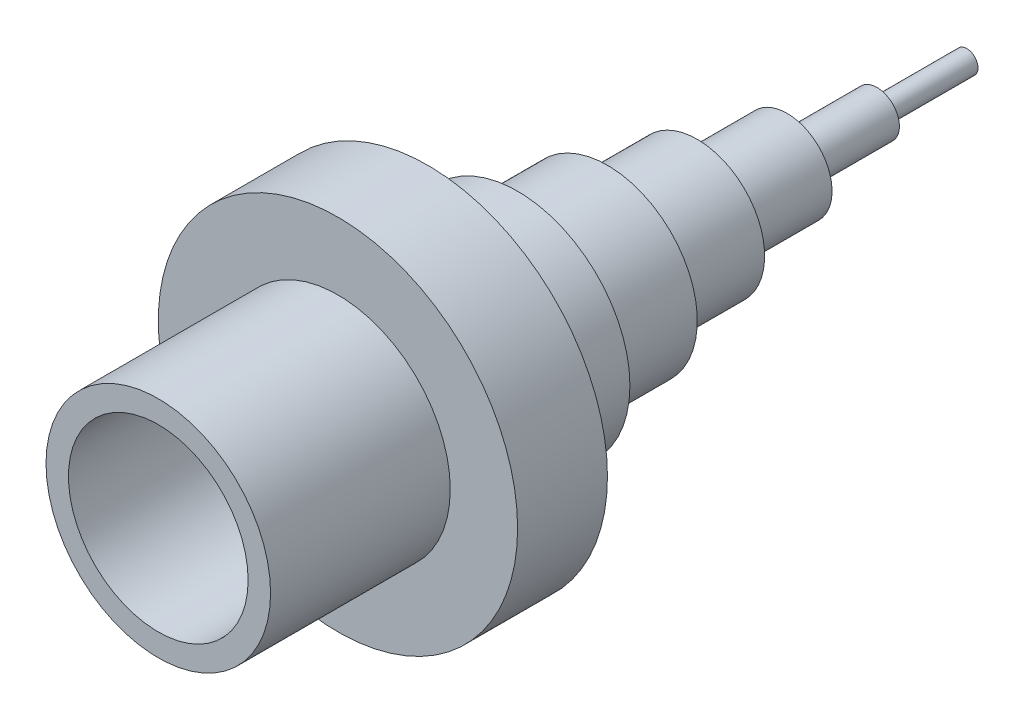
ISO-10303-21;
HEADER;
FILE_DESCRIPTION(('STEP AP214'),'2;1');
FILE_NAME('part.step','',(''),(''),'','','');
FILE_SCHEMA(('AUTOMOTIVE_DESIGN { 1 0 10303 214 1 1 1 1 }'));
ENDSEC;
DATA;
#1=APPLICATION_CONTEXT('core data for automotive mechanical design processes');
#2=APPLICATION_PROTOCOL_DEFINITION('international standard','automotive_design',2000,#1);
#3=PRODUCT_CONTEXT('',#1,'mechanical');
#4=PRODUCT('Part','Part','',(#3));
#5=PRODUCT_RELATED_PRODUCT_CATEGORY('part','',(#4));
#6=PRODUCT_DEFINITION_FORMATION('','',#4);
#7=PRODUCT_DEFINITION_CONTEXT('part definition',#1,'design');
#8=PRODUCT_DEFINITION('design','',#6,#7);
#9=PRODUCT_DEFINITION_SHAPE('','',#8);
#10=(LENGTH_UNIT() NAMED_UNIT(*) SI_UNIT(.MILLI.,.METRE.));
#11=(NAMED_UNIT(*) PLANE_ANGLE_UNIT() SI_UNIT($,.RADIAN.));
#12=(NAMED_UNIT(*) SI_UNIT($,.STERADIAN.) SOLID_ANGLE_UNIT());
#13=UNCERTAINTY_MEASURE_WITH_UNIT(LENGTH_MEASURE(1.E-05),#10,'distance_accuracy_value','');
#14=(GEOMETRIC_REPRESENTATION_CONTEXT(3) GLOBAL_UNCERTAINTY_ASSIGNED_CONTEXT((#13)) GLOBAL_UNIT_ASSIGNED_CONTEXT((#10,
#11,#12)) REPRESENTATION_CONTEXT('',''));
#15=CARTESIAN_POINT('',(0.,0.,0.));
#16=DIRECTION('',(0.,0.,1.));
#17=DIRECTION('',(1.,0.,0.));
#18=AXIS2_PLACEMENT_3D('',#15,#16,#17);
#19=CARTESIAN_POINT('',(0.,0.,508.));
#20=DIRECTION('',(0.,0.,-1.));
#21=DIRECTION('',(-1.,0.,0.));
#22=AXIS2_PLACEMENT_3D('',#19,#20,#21);
#23=CYLINDRICAL_SURFACE('',#22,1016.);
#24=CARTESIAN_POINT('',(0.,0.,508.));
#25=DIRECTION('',(0.,0.,1.));
#26=DIRECTION('',(1.,0.,0.));
#27=AXIS2_PLACEMENT_3D('',#24,#25,#26);
#28=CIRCLE('',#27,1016.);
#29=CARTESIAN_POINT('',(1016.,0.,508.));
#30=VERTEX_POINT('',#29);
#31=EDGE_CURVE('E84',#30,#30,#28,.T.);
#32=ORIENTED_EDGE('',*,*,#31,.F.);
#33=EDGE_LOOP('',(#32));
#34=FACE_BOUND('',#33,.T.);
#35=CARTESIAN_POINT('',(0.,0.,0.));
#36=DIRECTION('',(0.,0.,1.));
#37=DIRECTION('',(1.,0.,0.));
#38=AXIS2_PLACEMENT_3D('',#35,#36,#37);
#39=CIRCLE('',#38,1016.);
#40=CARTESIAN_POINT('',(1016.,0.,0.));
#41=VERTEX_POINT('',#40);
#42=EDGE_CURVE('E81',#41,#41,#39,.T.);
#43=ORIENTED_EDGE('',*,*,#42,.T.);
#44=EDGE_LOOP('',(#43));
#45=FACE_BOUND('',#44,.T.);
#46=ADVANCED_FACE('F31',(#34,#45),#23,.T.);
#47=CARTESIAN_POINT('',(0.,0.,508.));
#48=DIRECTION('',(0.,0.,1.));
#49=DIRECTION('',(1.,0.,0.));
#50=AXIS2_PLACEMENT_3D('',#47,#48,#49);
#51=PLANE('',#50);
#52=CARTESIAN_POINT('',(0.,0.,508.));
#53=DIRECTION('',(0.,0.,1.));
#54=DIRECTION('',(1.,0.,0.));
#55=AXIS2_PLACEMENT_3D('',#52,#53,#54);
#56=CIRCLE('',#55,635.);
#57=CARTESIAN_POINT('',(635.,0.,508.));
#58=VERTEX_POINT('',#57);
#59=EDGE_CURVE('E77',#58,#58,#56,.T.);
#60=ORIENTED_EDGE('',*,*,#59,.F.);
#61=EDGE_LOOP('',(#60));
#62=FACE_BOUND('',#61,.T.);
#63=ORIENTED_EDGE('',*,*,#31,.T.);
#64=EDGE_LOOP('',(#63));
#65=FACE_BOUND('',#64,.T.);
#66=ADVANCED_FACE('F93',(#62,#65),#51,.T.);
#67=CARTESIAN_POINT('',(0.,0.,0.));
#68=DIRECTION('',(0.,0.,1.));
#69=DIRECTION('',(1.,0.,0.));
#70=AXIS2_PLACEMENT_3D('',#67,#68,#69);
#71=PLANE('',#70);
#72=CARTESIAN_POINT('',(0.,0.,0.));
#73=DIRECTION('',(0.,0.,-1.));
#74=DIRECTION('',(-1.,0.,0.));
#75=AXIS2_PLACEMENT_3D('',#72,#73,#74);
#76=CIRCLE('',#75,635.);
#77=CARTESIAN_POINT('',(-635.,0.,0.));
#78=VERTEX_POINT('',#77);
#79=EDGE_CURVE('E69',#78,#78,#76,.T.);
#80=ORIENTED_EDGE('',*,*,#79,.F.);
#81=EDGE_LOOP('',(#80));
#82=FACE_BOUND('',#81,.T.);
#83=ORIENTED_EDGE('',*,*,#42,.F.);
#84=EDGE_LOOP('',(#83));
#85=FACE_BOUND('',#84,.T.);
#86=ADVANCED_FACE('F90',(#82,#85),#71,.F.);
#87=CARTESIAN_POINT('',(0.,0.,1524.));
#88=DIRECTION('',(0.,0.,1.));
#89=DIRECTION('',(1.,0.,0.));
#90=AXIS2_PLACEMENT_3D('',#87,#88,#89);
#91=PLANE('',#90);
#92=CARTESIAN_POINT('',(0.,0.,1524.));
#93=DIRECTION('',(0.,0.,1.));
#94=DIRECTION('',(1.,0.,0.));
#95=AXIS2_PLACEMENT_3D('',#92,#93,#94);
#96=CIRCLE('',#95,635.);
#97=CARTESIAN_POINT('',(635.,0.,1524.));
#98=VERTEX_POINT('',#97);
#99=EDGE_CURVE('E78',#98,#98,#96,.T.);
#100=ORIENTED_EDGE('',*,*,#99,.T.);
#101=EDGE_LOOP('',(#100));
#102=FACE_BOUND('',#101,.T.);
#103=CARTESIAN_POINT('',(0.,0.,1524.));
#104=DIRECTION('',(0.,0.,1.));
#105=DIRECTION('',(1.,0.,0.));
#106=AXIS2_PLACEMENT_3D('',#103,#104,#105);
#107=CIRCLE('',#106,508.);
#108=CARTESIAN_POINT('',(508.,0.,1524.));
#109=VERTEX_POINT('',#108);
#110=EDGE_CURVE('E72',#109,#109,#107,.T.);
#111=ORIENTED_EDGE('',*,*,#110,.F.);
#112=EDGE_LOOP('',(#111));
#113=FACE_BOUND('',#112,.T.);
#114=ADVANCED_FACE('F92',(#102,#113),#91,.T.);
#115=CARTESIAN_POINT('',(0.,0.,1524.));
#116=DIRECTION('',(0.,0.,-1.));
#117=DIRECTION('',(-1.,0.,0.));
#118=AXIS2_PLACEMENT_3D('',#115,#116,#117);
#119=CYLINDRICAL_SURFACE('',#118,635.);
#120=ORIENTED_EDGE('',*,*,#99,.F.);
#121=EDGE_LOOP('',(#120));
#122=FACE_BOUND('',#121,.T.);
#123=ORIENTED_EDGE('',*,*,#59,.T.);
#124=EDGE_LOOP('',(#123));
#125=FACE_BOUND('',#124,.T.);
#126=ADVANCED_FACE('F99',(#122,#125),#119,.T.);
#127=CARTESIAN_POINT('',(0.,0.,1524.));
#128=DIRECTION('',(0.,0.,-1.));
#129=DIRECTION('',(-1.,0.,0.));
#130=AXIS2_PLACEMENT_3D('',#127,#128,#129);
#131=CYLINDRICAL_SURFACE('',#130,508.);
#132=ORIENTED_EDGE('',*,*,#110,.T.);
#133=EDGE_LOOP('',(#132));
#134=FACE_BOUND('',#133,.T.);
#135=CARTESIAN_POINT('',(0.,0.,508.));
#136=DIRECTION('',(0.,0.,1.));
#137=DIRECTION('',(1.,0.,0.));
#138=AXIS2_PLACEMENT_3D('',#135,#136,#137);
#139=CIRCLE('',#138,508.);
#140=CARTESIAN_POINT('',(508.,0.,508.));
#141=VERTEX_POINT('',#140);
#142=EDGE_CURVE('E34',#141,#141,#139,.F.);
#143=ORIENTED_EDGE('',*,*,#142,.T.);
#144=EDGE_LOOP('',(#143));
#145=FACE_BOUND('',#144,.T.);
#146=ADVANCED_FACE('F133',(#134,#145),#131,.F.);
#147=ORIENTED_EDGE('',*,*,#142,.F.);
#148=EDGE_LOOP('',(#147));
#149=FACE_BOUND('',#148,.T.);
#150=ADVANCED_FACE('F104',(#149),#51,.T.);
#151=CARTESIAN_POINT('',(0.,0.,-508.));
#152=DIRECTION('',(0.,0.,1.));
#153=DIRECTION('',(1.,0.,0.));
#154=AXIS2_PLACEMENT_3D('',#151,#152,#153);
#155=CYLINDRICAL_SURFACE('',#154,635.);
#156=CARTESIAN_POINT('',(0.,0.,-508.));
#157=DIRECTION('',(0.,0.,-1.));
#158=DIRECTION('',(-1.,0.,0.));
#159=AXIS2_PLACEMENT_3D('',#156,#157,#158);
#160=CIRCLE('',#159,635.);
#161=CARTESIAN_POINT('',(-635.,0.,-508.));
#162=VERTEX_POINT('',#161);
#163=EDGE_CURVE('E66',#162,#162,#160,.T.);
#164=ORIENTED_EDGE('',*,*,#163,.F.);
#165=EDGE_LOOP('',(#164));
#166=FACE_BOUND('',#165,.T.);
#167=ORIENTED_EDGE('',*,*,#79,.T.);
#168=EDGE_LOOP('',(#167));
#169=FACE_BOUND('',#168,.T.);
#170=ADVANCED_FACE('F151',(#166,#169),#155,.T.);
#171=CARTESIAN_POINT('',(0.,0.,-508.));
#172=DIRECTION('',(0.,0.,-1.));
#173=DIRECTION('',(-1.,0.,0.));
#174=AXIS2_PLACEMENT_3D('',#171,#172,#173);
#175=PLANE('',#174);
#176=CARTESIAN_POINT('',(0.,0.,-508.));
#177=DIRECTION('',(0.,0.,-1.));
#178=DIRECTION('',(-1.,0.,0.));
#179=AXIS2_PLACEMENT_3D('',#176,#177,#178);
#180=CIRCLE('',#179,508.);
#181=CARTESIAN_POINT('',(-508.,0.,-508.));
#182=VERTEX_POINT('',#181);
#183=EDGE_CURVE('E63',#182,#182,#180,.T.);
#184=ORIENTED_EDGE('',*,*,#183,.F.);
#185=EDGE_LOOP('',(#184));
#186=FACE_BOUND('',#185,.T.);
#187=ORIENTED_EDGE('',*,*,#163,.T.);
#188=EDGE_LOOP('',(#187));
#189=FACE_BOUND('',#188,.T.);
#190=ADVANCED_FACE('F163',(#186,#189),#175,.T.);
#191=CARTESIAN_POINT('',(0.,0.,-1016.));
#192=DIRECTION('',(0.,0.,1.));
#193=DIRECTION('',(1.,0.,0.));
#194=AXIS2_PLACEMENT_3D('',#191,#192,#193);
#195=CYLINDRICAL_SURFACE('',#194,508.);
#196=CARTESIAN_POINT('',(0.,0.,-1016.));
#197=DIRECTION('',(0.,0.,-1.));
#198=DIRECTION('',(-1.,0.,0.));
#199=AXIS2_PLACEMENT_3D('',#196,#197,#198);
#200=CIRCLE('',#199,508.);
#201=CARTESIAN_POINT('',(-508.,0.,-1016.));
#202=VERTEX_POINT('',#201);
#203=EDGE_CURVE('E60',#202,#202,#200,.T.);
#204=ORIENTED_EDGE('',*,*,#203,.F.);
#205=EDGE_LOOP('',(#204));
#206=FACE_BOUND('',#205,.T.);
#207=ORIENTED_EDGE('',*,*,#183,.T.);
#208=EDGE_LOOP('',(#207));
#209=FACE_BOUND('',#208,.T.);
#210=ADVANCED_FACE('F173',(#206,#209),#195,.T.);
#211=CARTESIAN_POINT('',(0.,0.,-1016.));
#212=DIRECTION('',(0.,0.,-1.));
#213=DIRECTION('',(-1.,0.,0.));
#214=AXIS2_PLACEMENT_3D('',#211,#212,#213);
#215=PLANE('',#214);
#216=CARTESIAN_POINT('',(0.,0.,-1016.));
#217=DIRECTION('',(0.,0.,-1.));
#218=DIRECTION('',(-1.,0.,0.));
#219=AXIS2_PLACEMENT_3D('',#216,#217,#218);
#220=CIRCLE('',#219,381.);
#221=CARTESIAN_POINT('',(-381.,0.,-1016.));
#222=VERTEX_POINT('',#221);
#223=EDGE_CURVE('E57',#222,#222,#220,.T.);
#224=ORIENTED_EDGE('',*,*,#223,.F.);
#225=EDGE_LOOP('',(#224));
#226=FACE_BOUND('',#225,.T.);
#227=ORIENTED_EDGE('',*,*,#203,.T.);
#228=EDGE_LOOP('',(#227));
#229=FACE_BOUND('',#228,.T.);
#230=ADVANCED_FACE('F183',(#226,#229),#215,.T.);
#231=CARTESIAN_POINT('',(0.,0.,-1524.));
#232=DIRECTION('',(0.,0.,1.));
#233=DIRECTION('',(1.,0.,0.));
#234=AXIS2_PLACEMENT_3D('',#231,#232,#233);
#235=CYLINDRICAL_SURFACE('',#234,381.);
#236=CARTESIAN_POINT('',(0.,0.,-1524.));
#237=DIRECTION('',(0.,0.,-1.));
#238=DIRECTION('',(-1.,0.,0.));
#239=AXIS2_PLACEMENT_3D('',#236,#237,#238);
#240=CIRCLE('',#239,381.);
#241=CARTESIAN_POINT('',(-381.,0.,-1524.));
#242=VERTEX_POINT('',#241);
#243=EDGE_CURVE('E54',#242,#242,#240,.T.);
#244=ORIENTED_EDGE('',*,*,#243,.F.);
#245=EDGE_LOOP('',(#244));
#246=FACE_BOUND('',#245,.T.);
#247=ORIENTED_EDGE('',*,*,#223,.T.);
#248=EDGE_LOOP('',(#247));
#249=FACE_BOUND('',#248,.T.);
#250=ADVANCED_FACE('F193',(#246,#249),#235,.T.);
#251=CARTESIAN_POINT('',(0.,0.,-1524.));
#252=DIRECTION('',(0.,0.,-1.));
#253=DIRECTION('',(-1.,0.,0.));
#254=AXIS2_PLACEMENT_3D('',#251,#252,#253);
#255=PLANE('',#254);
#256=CARTESIAN_POINT('',(0.,0.,-1524.));
#257=DIRECTION('',(0.,0.,-1.));
#258=DIRECTION('',(-1.,0.,0.));
#259=AXIS2_PLACEMENT_3D('',#256,#257,#258);
#260=CIRCLE('',#259,254.);
#261=CARTESIAN_POINT('',(-254.,0.,-1524.));
#262=VERTEX_POINT('',#261);
#263=EDGE_CURVE('E43',#262,#262,#260,.T.);
#264=ORIENTED_EDGE('',*,*,#263,.F.);
#265=EDGE_LOOP('',(#264));
#266=FACE_BOUND('',#265,.T.);
#267=ORIENTED_EDGE('',*,*,#243,.T.);
#268=EDGE_LOOP('',(#267));
#269=FACE_BOUND('',#268,.T.);
#270=ADVANCED_FACE('F203',(#266,#269),#255,.T.);
#271=CARTESIAN_POINT('',(0.,0.,-2032.));
#272=DIRECTION('',(0.,0.,1.));
#273=DIRECTION('',(1.,0.,0.));
#274=AXIS2_PLACEMENT_3D('',#271,#272,#273);
#275=CYLINDRICAL_SURFACE('',#274,254.);
#276=CARTESIAN_POINT('',(0.,0.,-2032.));
#277=DIRECTION('',(0.,0.,-1.));
#278=DIRECTION('',(-1.,0.,0.));
#279=AXIS2_PLACEMENT_3D('',#276,#277,#278);
#280=CIRCLE('',#279,254.);
#281=CARTESIAN_POINT('',(-254.,0.,-2032.));
#282=VERTEX_POINT('',#281);
#283=EDGE_CURVE('E50',#282,#282,#280,.T.);
#284=ORIENTED_EDGE('',*,*,#283,.F.);
#285=EDGE_LOOP('',(#284));
#286=FACE_BOUND('',#285,.T.);
#287=ORIENTED_EDGE('',*,*,#263,.T.);
#288=EDGE_LOOP('',(#287));
#289=FACE_BOUND('',#288,.T.);
#290=ADVANCED_FACE('F213',(#286,#289),#275,.T.);
#291=CARTESIAN_POINT('',(0.,0.,-2032.));
#292=DIRECTION('',(0.,0.,-1.));
#293=DIRECTION('',(-1.,0.,0.));
#294=AXIS2_PLACEMENT_3D('',#291,#292,#293);
#295=PLANE('',#294);
#296=CARTESIAN_POINT('',(0.,0.,-2032.));
#297=DIRECTION('',(0.,0.,-1.));
#298=DIRECTION('',(-1.,0.,0.));
#299=AXIS2_PLACEMENT_3D('',#296,#297,#298);
#300=CIRCLE('',#299,127.);
#301=CARTESIAN_POINT('',(-127.,0.,-2032.));
#302=VERTEX_POINT('',#301);
#303=EDGE_CURVE('E38',#302,#302,#300,.T.);
#304=ORIENTED_EDGE('',*,*,#303,.F.);
#305=EDGE_LOOP('',(#304));
#306=FACE_BOUND('',#305,.T.);
#307=ORIENTED_EDGE('',*,*,#283,.T.);
#308=EDGE_LOOP('',(#307));
#309=FACE_BOUND('',#308,.T.);
#310=ADVANCED_FACE('F223',(#306,#309),#295,.T.);
#311=CARTESIAN_POINT('',(0.,0.,-2540.));
#312=DIRECTION('',(0.,0.,1.));
#313=DIRECTION('',(1.,0.,0.));
#314=AXIS2_PLACEMENT_3D('',#311,#312,#313);
#315=CYLINDRICAL_SURFACE('',#314,127.);
#316=CARTESIAN_POINT('',(0.,0.,-2540.));
#317=DIRECTION('',(0.,0.,-1.));
#318=DIRECTION('',(-1.,0.,0.));
#319=AXIS2_PLACEMENT_3D('',#316,#317,#318);
#320=CIRCLE('',#319,127.);
#321=CARTESIAN_POINT('',(-127.,0.,-2540.));
#322=VERTEX_POINT('',#321);
#323=EDGE_CURVE('E48',#322,#322,#320,.T.);
#324=ORIENTED_EDGE('',*,*,#323,.F.);
#325=EDGE_LOOP('',(#324));
#326=FACE_BOUND('',#325,.T.);
#327=ORIENTED_EDGE('',*,*,#303,.T.);
#328=EDGE_LOOP('',(#327));
#329=FACE_BOUND('',#328,.T.);
#330=ADVANCED_FACE('F233',(#326,#329),#315,.T.);
#331=CARTESIAN_POINT('',(0.,0.,-2540.));
#332=DIRECTION('',(0.,0.,-1.));
#333=DIRECTION('',(-1.,0.,0.));
#334=AXIS2_PLACEMENT_3D('',#331,#332,#333);
#335=PLANE('',#334);
#336=CARTESIAN_POINT('',(0.,0.,-2540.));
#337=DIRECTION('',(0.,0.,-1.));
#338=DIRECTION('',(-1.,0.,0.));
#339=AXIS2_PLACEMENT_3D('',#336,#337,#338);
#340=CIRCLE('',#339,63.5);
#341=CARTESIAN_POINT('',(-63.5,0.,-2540.));
#342=VERTEX_POINT('',#341);
#343=EDGE_CURVE('E10',#342,#342,#340,.T.);
#344=ORIENTED_EDGE('',*,*,#343,.F.);
#345=EDGE_LOOP('',(#344));
#346=FACE_BOUND('',#345,.T.);
#347=ORIENTED_EDGE('',*,*,#323,.T.);
#348=EDGE_LOOP('',(#347));
#349=FACE_BOUND('',#348,.T.);
#350=ADVANCED_FACE('F243',(#346,#349),#335,.T.);
#351=CARTESIAN_POINT('',(0.,0.,-3048.));
#352=DIRECTION('',(0.,0.,1.));
#353=DIRECTION('',(1.,0.,0.));
#354=AXIS2_PLACEMENT_3D('',#351,#352,#353);
#355=CYLINDRICAL_SURFACE('',#354,63.5);
#356=CARTESIAN_POINT('',(0.,0.,-3048.));
#357=DIRECTION('',(0.,0.,-1.));
#358=DIRECTION('',(-1.,0.,0.));
#359=AXIS2_PLACEMENT_3D('',#356,#357,#358);
#360=CIRCLE('',#359,63.5);
#361=CARTESIAN_POINT('',(-63.5,0.,-3048.));
#362=VERTEX_POINT('',#361);
#363=EDGE_CURVE('E47',#362,#362,#360,.T.);
#364=ORIENTED_EDGE('',*,*,#363,.F.);
#365=EDGE_LOOP('',(#364));
#366=FACE_BOUND('',#365,.T.);
#367=ORIENTED_EDGE('',*,*,#343,.T.);
#368=EDGE_LOOP('',(#367));
#369=FACE_BOUND('',#368,.T.);
#370=ADVANCED_FACE('F253',(#366,#369),#355,.T.);
#371=CARTESIAN_POINT('',(0.,0.,-3048.));
#372=DIRECTION('',(0.,0.,-1.));
#373=DIRECTION('',(-1.,0.,0.));
#374=AXIS2_PLACEMENT_3D('',#371,#372,#373);
#375=PLANE('',#374);
#376=ORIENTED_EDGE('',*,*,#363,.T.);
#377=EDGE_LOOP('',(#376));
#378=FACE_BOUND('',#377,.T.);
#379=ADVANCED_FACE('F263',(#378),#375,.T.);
#380=CLOSED_SHELL('',(#46,#66,#86,#114,#126,#146,#150,#170,#190,#210,#230,#250,#270,#290,#310,
#330,#350,#370,#379));
#381=MANIFOLD_SOLID_BREP('B2',#380);
#382=ADVANCED_BREP_SHAPE_REPRESENTATION('',(#18,#381),#14);
#383=SHAPE_DEFINITION_REPRESENTATION(#9,#382);
ENDSEC;
END-ISO-10303-21;
